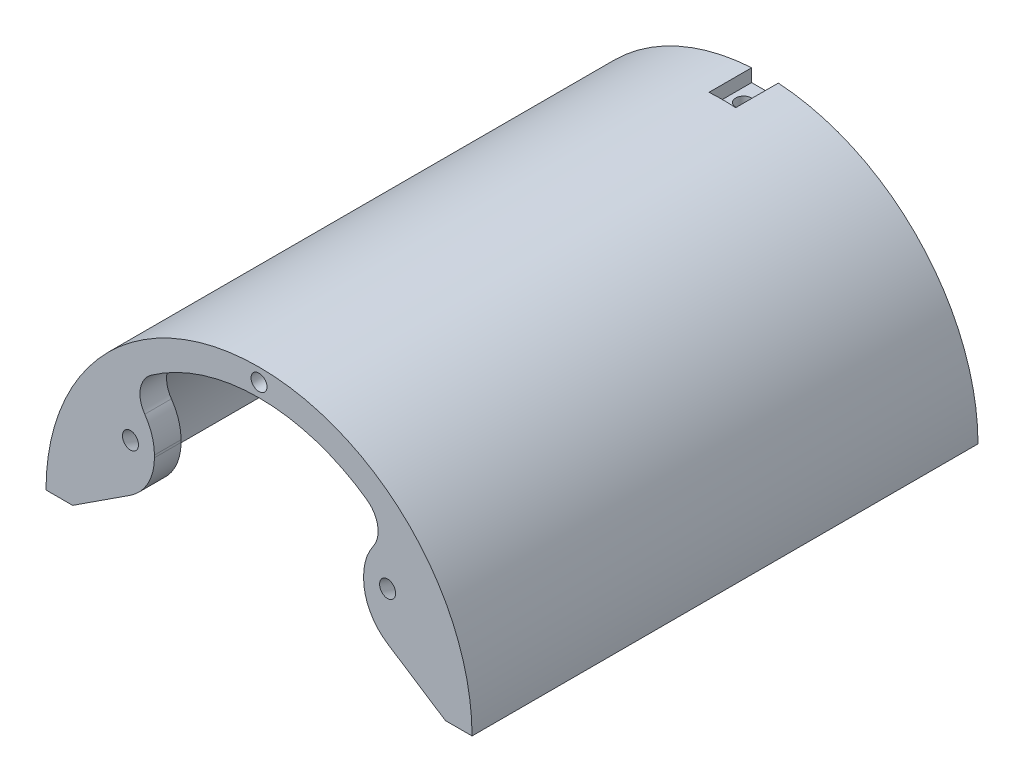
ISO-10303-21;
HEADER;
FILE_DESCRIPTION(('STEP AP214'),'2;1');
FILE_NAME('part.step','',(''),(''),'','','');
FILE_SCHEMA(('AUTOMOTIVE_DESIGN { 1 0 10303 214 1 1 1 1 }'));
ENDSEC;
DATA;
#1=APPLICATION_CONTEXT('core data for automotive mechanical design processes');
#2=APPLICATION_PROTOCOL_DEFINITION('international standard','automotive_design',2000,#1);
#3=PRODUCT_CONTEXT('',#1,'mechanical');
#4=PRODUCT('Part','Part','',(#3));
#5=PRODUCT_RELATED_PRODUCT_CATEGORY('part','',(#4));
#6=PRODUCT_DEFINITION_FORMATION('','',#4);
#7=PRODUCT_DEFINITION_CONTEXT('part definition',#1,'design');
#8=PRODUCT_DEFINITION('design','',#6,#7);
#9=PRODUCT_DEFINITION_SHAPE('','',#8);
#10=(LENGTH_UNIT() NAMED_UNIT(*) SI_UNIT(.MILLI.,.METRE.));
#11=(NAMED_UNIT(*) PLANE_ANGLE_UNIT() SI_UNIT($,.RADIAN.));
#12=(NAMED_UNIT(*) SI_UNIT($,.STERADIAN.) SOLID_ANGLE_UNIT());
#13=UNCERTAINTY_MEASURE_WITH_UNIT(LENGTH_MEASURE(1.E-05),#10,'distance_accuracy_value','');
#14=(GEOMETRIC_REPRESENTATION_CONTEXT(3) GLOBAL_UNCERTAINTY_ASSIGNED_CONTEXT((#13)) GLOBAL_UNIT_ASSIGNED_CONTEXT((#10,
#11,#12)) REPRESENTATION_CONTEXT('',''));
#15=CARTESIAN_POINT('',(0.,0.,0.));
#16=DIRECTION('',(0.,0.,1.));
#17=DIRECTION('',(1.,0.,0.));
#18=AXIS2_PLACEMENT_3D('',#15,#16,#17);
#19=CARTESIAN_POINT('',(0.,0.,95.));
#20=DIRECTION('',(0.,0.,-1.));
#21=DIRECTION('',(-1.,0.,0.));
#22=AXIS2_PLACEMENT_3D('',#19,#20,#21);
#23=CYLINDRICAL_SURFACE('',#22,35.);
#24=CARTESIAN_POINT('',(0.,0.,90.));
#25=DIRECTION('',(0.,0.,-1.));
#26=DIRECTION('',(-1.,0.,0.));
#27=AXIS2_PLACEMENT_3D('',#24,#25,#26);
#28=CIRCLE('',#27,35.);
#29=CARTESIAN_POINT('',(20.2514071764176,28.5461119484763,90.));
#30=VERTEX_POINT('',#29);
#31=CARTESIAN_POINT('',(35.,0.,90.));
#32=VERTEX_POINT('',#31);
#33=EDGE_CURVE('E270',#30,#32,#28,.T.);
#34=ORIENTED_EDGE('',*,*,#33,.F.);
#35=DIRECTION('',(0.,0.,-1.));
#36=VECTOR('',#35,1.);
#37=CARTESIAN_POINT('',(20.2514071764176,28.5461119484763,95.));
#38=LINE('',#37,#36);
#39=CARTESIAN_POINT('',(20.2514071764176,28.5461119484763,95.));
#40=VERTEX_POINT('',#39);
#41=EDGE_CURVE('E331',#30,#40,#38,.F.);
#42=ORIENTED_EDGE('',*,*,#41,.T.);
#43=CARTESIAN_POINT('',(0.,0.,95.));
#44=DIRECTION('',(0.,0.,1.));
#45=DIRECTION('',(1.,0.,0.));
#46=AXIS2_PLACEMENT_3D('',#43,#44,#45);
#47=CIRCLE('',#46,35.);
#48=CARTESIAN_POINT('',(-20.2514071764176,28.5461119484763,95.));
#49=VERTEX_POINT('',#48);
#50=EDGE_CURVE('E218',#40,#49,#47,.T.);
#51=ORIENTED_EDGE('',*,*,#50,.T.);
#52=DIRECTION('',(0.,0.,-1.));
#53=VECTOR('',#52,1.);
#54=CARTESIAN_POINT('',(-20.2514071764176,28.5461119484763,95.));
#55=LINE('',#54,#53);
#56=CARTESIAN_POINT('',(-20.2514071764176,28.5461119484763,90.));
#57=VERTEX_POINT('',#56);
#58=EDGE_CURVE('E327',#49,#57,#55,.T.);
#59=ORIENTED_EDGE('',*,*,#58,.T.);
#60=CARTESIAN_POINT('',(0.,0.,90.));
#61=DIRECTION('',(0.,0.,1.));
#62=DIRECTION('',(1.,0.,0.));
#63=AXIS2_PLACEMENT_3D('',#60,#61,#62);
#64=CIRCLE('',#63,35.);
#65=CARTESIAN_POINT('',(-35.,0.,90.));
#66=VERTEX_POINT('',#65);
#67=EDGE_CURVE('E370',#57,#66,#64,.T.);
#68=ORIENTED_EDGE('',*,*,#67,.T.);
#69=DIRECTION('',(0.,0.,-1.));
#70=VECTOR('',#69,1.);
#71=CARTESIAN_POINT('',(-35.,0.,95.));
#72=LINE('',#71,#70);
#73=CARTESIAN_POINT('',(-35.,0.,0.));
#74=VERTEX_POINT('',#73);
#75=EDGE_CURVE('E223',#66,#74,#72,.T.);
#76=ORIENTED_EDGE('',*,*,#75,.T.);
#77=CARTESIAN_POINT('',(0.,0.,0.));
#78=DIRECTION('',(0.,0.,1.));
#79=DIRECTION('',(1.,0.,0.));
#80=AXIS2_PLACEMENT_3D('',#77,#78,#79);
#81=CIRCLE('',#80,35.);
#82=CARTESIAN_POINT('',(35.,0.,0.));
#83=VERTEX_POINT('',#82);
#84=EDGE_CURVE('E214',#83,#74,#81,.T.);
#85=ORIENTED_EDGE('',*,*,#84,.F.);
#86=DIRECTION('',(0.,0.,-1.));
#87=VECTOR('',#86,1.);
#88=CARTESIAN_POINT('',(35.,0.,95.));
#89=LINE('',#88,#87);
#90=EDGE_CURVE('E224',#32,#83,#89,.T.);
#91=ORIENTED_EDGE('',*,*,#90,.F.);
#92=EDGE_LOOP('',(#34,#42,#51,#59,#68,#76,#85,#91));
#93=FACE_BOUND('',#92,.T.);
#94=CARTESIAN_POINT('',(0.,35.,5.5));
#95=CARTESIAN_POINT('',(-0.0842141773933812,34.9999995687038,5.49999627839367));
#96=CARTESIAN_POINT('',(-0.168488433020987,34.9996927984853,5.49288415881228));
#97=CARTESIAN_POINT('',(-0.334713142916146,34.9984985225936,5.46461278995566));
#98=CARTESIAN_POINT('',(-0.416660723394537,34.9976103287787,5.44343689511975));
#99=CARTESIAN_POINT('',(-0.575800034446508,34.9953537579411,5.38764446172472));
#100=CARTESIAN_POINT('',(-0.652994126083347,34.9939856216053,5.35303465922293));
#101=CARTESIAN_POINT('',(-0.800455673985712,34.9909233493655,5.27136692561602));
#102=CARTESIAN_POINT('',(-0.870724782932214,34.9892292915305,5.22431197452963));
#103=CARTESIAN_POINT('',(-1.00241774406214,34.9857043424946,5.11904823599837));
#104=CARTESIAN_POINT('',(-1.06383557240901,34.9838733593828,5.06083191476613));
#105=CARTESIAN_POINT('',(-1.17603137417381,34.980281720708,4.93491257329539));
#106=CARTESIAN_POINT('',(-1.22680891752576,34.9785210679899,4.8672091697863));
#107=CARTESIAN_POINT('',(-1.3162976374253,34.9752680292143,4.7242081391099));
#108=CARTESIAN_POINT('',(-1.35500437354876,34.9737757419643,4.64890773072248));
#109=CARTESIAN_POINT('',(-1.41922416901026,34.9712287687358,4.49286982802167));
#110=CARTESIAN_POINT('',(-1.4447373088634,34.970174080087,4.41213236689179));
#111=CARTESIAN_POINT('',(-1.48183048756292,34.9686220271413,4.24756524236876));
#112=CARTESIAN_POINT('',(-1.49341915651929,34.9681243176531,4.16373752749676));
#113=CARTESIAN_POINT('',(-1.50236104996785,34.9677413091198,3.99532520987646));
#114=CARTESIAN_POINT('',(-1.49971436377358,34.9678560062325,3.91074061188022));
#115=CARTESIAN_POINT('',(-1.48026789040832,34.9686845556764,3.74327417490877));
#116=CARTESIAN_POINT('',(-1.46347742450472,34.9693980134013,3.66039125131048));
#117=CARTESIAN_POINT('',(-1.41623444829705,34.9713430431507,3.49862151356354));
#118=CARTESIAN_POINT('',(-1.38578189170039,34.9725746169307,3.41973471295634));
#119=CARTESIAN_POINT('',(-1.31206849917113,34.9754175148246,3.26816648387337));
#120=CARTESIAN_POINT('',(-1.26880340379721,34.9770289651895,3.19548712938968));
#121=CARTESIAN_POINT('',(-1.17069618958064,34.9804498468775,3.05841959305896));
#122=CARTESIAN_POINT('',(-1.11585401192391,34.9822592792063,2.9940314533358));
#123=CARTESIAN_POINT('',(-0.996096749926197,34.9858739241882,2.87531982290765));
#124=CARTESIAN_POINT('',(-0.931173590451646,34.9876791322704,2.82100447798953));
#125=CARTESIAN_POINT('',(-0.79312571390509,34.9910804445647,2.72404299517928));
#126=CARTESIAN_POINT('',(-0.720000995136543,34.9926765487336,2.68139685970101));
#127=CARTESIAN_POINT('',(-0.567621069869864,34.995479802305,2.60898519348259));
#128=CARTESIAN_POINT('',(-0.488365733619494,34.9966869434726,2.57921993544939));
#129=CARTESIAN_POINT('',(-0.325976420367389,34.9985760880862,2.53342022271569));
#130=CARTESIAN_POINT('',(-0.242842464741656,34.999258094426,2.51738569235129));
#131=CARTESIAN_POINT('',(-0.075126523020424,35.0000197284916,2.49951261188446));
#132=CARTESIAN_POINT('',(0.00945426008265541,35.0000998343978,2.49766279269911));
#133=CARTESIAN_POINT('',(0.177725087075366,34.9996499072408,2.5081822527273));
#134=CARTESIAN_POINT('',(0.261415133116042,34.9991198756513,2.52055149759531));
#135=CARTESIAN_POINT('',(0.425497324935205,34.9975096951572,2.55914864179093));
#136=CARTESIAN_POINT('',(0.505890680469104,34.9964297500369,2.58537140748255));
#137=CARTESIAN_POINT('',(0.661134639785664,34.9938413731953,2.65092602134868));
#138=CARTESIAN_POINT('',(0.735985220227325,34.9923329396698,2.69025792472281));
#139=CARTESIAN_POINT('',(0.878070696644747,34.9890561827892,2.78094324974041));
#140=CARTESIAN_POINT('',(0.945300759285419,34.98728769611,2.83230423825126));
#141=CARTESIAN_POINT('',(1.0701882117262,34.9836906035575,2.94557870638664));
#142=CARTESIAN_POINT('',(1.12784555548201,34.9818619973951,3.00749223676546));
#143=CARTESIAN_POINT('',(1.2319887089577,34.9783494249298,3.14016269621984));
#144=CARTESIAN_POINT('',(1.27846723634721,34.9766655533692,3.21092534459797));
#145=CARTESIAN_POINT('',(1.35888363763632,34.9736338053594,3.35925635663163));
#146=CARTESIAN_POINT('',(1.3928215552549,34.9722859277388,3.43682469656005));
#147=CARTESIAN_POINT('',(1.44718063191892,34.9700788276315,3.59653805104394));
#148=CARTESIAN_POINT('',(1.4676064617553,34.9692194363017,3.67868147345112));
#149=CARTESIAN_POINT('',(1.49437683697421,34.9680857373277,3.84523561565203));
#150=CARTESIAN_POINT('',(1.50072143423487,34.9678114275279,3.92964632709146));
#151=CARTESIAN_POINT('',(1.49914871069467,34.9678788823128,4.09826635950605));
#152=CARTESIAN_POINT('',(1.49124285296202,34.9682201517256,4.18247578783743));
#153=CARTESIAN_POINT('',(1.46141729365384,34.9694792533025,4.3483707611638));
#154=CARTESIAN_POINT('',(1.4394975648702,34.9703970865859,4.43005630125831));
#155=CARTESIAN_POINT('',(1.38226864245956,34.9727057575905,4.58858763612856));
#156=CARTESIAN_POINT('',(1.34695928623372,34.9740966010557,4.66543337211823));
#157=CARTESIAN_POINT('',(1.26395579379531,34.9771944696407,4.8121059488097));
#158=CARTESIAN_POINT('',(1.21626206564919,34.9789014843421,4.88193302067212));
#159=CARTESIAN_POINT('',(1.10980407972214,34.9824408146562,5.01264247038006));
#160=CARTESIAN_POINT('',(1.05103213534307,34.984273216703,5.07351858510265));
#161=CARTESIAN_POINT('',(0.924085378422847,34.9878563121508,5.18455820869491));
#162=CARTESIAN_POINT('',(0.855908250089803,34.9896069852856,5.23471907142506));
#163=CARTESIAN_POINT('',(0.71204411229204,34.992830278554,5.32292152087255));
#164=CARTESIAN_POINT('',(0.63635092610815,34.9943026670589,5.36095302973176));
#165=CARTESIAN_POINT('',(0.47970475566945,34.9967997658715,5.42372284790231));
#166=CARTESIAN_POINT('',(0.398758137226582,34.9978250067872,5.44847692096167));
#167=CARTESIAN_POINT('',(0.264420890708546,34.9990399346826,5.47746831165779));
#168=CARTESIAN_POINT('',(0.211901171146152,34.9993983853024,5.48590697225835));
#169=CARTESIAN_POINT('',(0.106262275599526,34.9998785539722,5.49717398895523));
#170=CARTESIAN_POINT('',(0.0531430999846706,35.0000002721682,5.50000234850834));
#171=CARTESIAN_POINT('',(0.,35.,5.5));
#172=B_SPLINE_CURVE_WITH_KNOTS('',3,(#94,#95,#96,#97,#98,#99,#100,#101,#102,#103,#104,#105,#106,
#107,#108,#109,#110,#111,#112,#113,#114,#115,#116,#117,#118,#119,#120,#121,#122,#123,#124,#125,
#126,#127,#128,#129,#130,#131,#132,#133,#134,#135,#136,#137,#138,#139,#140,#141,#142,#143,#144,
#145,#146,#147,#148,#149,#150,#151,#152,#153,#154,#155,#156,#157,#158,#159,#160,#161,#162,#163,
#164,#165,#166,#167,#168,#169,#170,#171),.UNSPECIFIED.,.T.,.F.,(4,2,2,2,2,2,2,2,2,2,2,2,2,2,2,2,
2,2,2,2,2,2,2,2,2,2,2,2,2,2,2,2,2,2,2,2,2,2,4),(0.,0.252448545444622,0.505196416931058,
0.757817718441212,1.01037858389476,1.26311052885797,1.51585268693641,1.76868771056216,
2.02152119122104,2.274197889757,2.52687300298501,2.77938172424761,3.03189130111635,
3.28448491749188,3.5370798171289,3.78987810582186,4.04267644680776,4.29548013964122,
4.54828243937758,4.8008838788007,5.05348470807733,5.30599199780728,5.55850035080205,
5.81116797223335,6.0638368089481,6.3166698011679,6.56950191195506,6.82224657926928,
7.07499031541883,7.32753083518844,7.5800718452701,7.83261592221738,8.08515167886445,
8.33786330626551,8.59063726903107,8.84362070902732,9.09630312369772,9.25561010707058,
9.41491699228634),.UNSPECIFIED.);
#173=CARTESIAN_POINT('',(0.,35.,5.5));
#174=VERTEX_POINT('',#173);
#175=EDGE_CURVE('E184',#174,#174,#172,.T.);
#176=ORIENTED_EDGE('',*,*,#175,.F.);
#177=EDGE_LOOP('',(#176));
#178=FACE_BOUND('',#177,.T.);
#179=ADVANCED_FACE('F44',(#93,#178),#23,.F.);
#180=CARTESIAN_POINT('',(0.,0.,95.));
#181=DIRECTION('',(0.,0.,-1.));
#182=DIRECTION('',(-1.,0.,0.));
#183=AXIS2_PLACEMENT_3D('',#180,#181,#182);
#184=CYLINDRICAL_SURFACE('',#183,40.);
#185=DIRECTION('',(0.,0.,-1.));
#186=VECTOR('',#185,1.);
#187=CARTESIAN_POINT('',(-40.,0.,95.));
#188=LINE('',#187,#186);
#189=CARTESIAN_POINT('',(-40.,0.,95.));
#190=VERTEX_POINT('',#189);
#191=CARTESIAN_POINT('',(-40.,0.,0.));
#192=VERTEX_POINT('',#191);
#193=EDGE_CURVE('E254',#190,#192,#188,.T.);
#194=ORIENTED_EDGE('',*,*,#193,.F.);
#195=CARTESIAN_POINT('',(0.,0.,95.));
#196=DIRECTION('',(0.,0.,1.));
#197=DIRECTION('',(1.,0.,0.));
#198=AXIS2_PLACEMENT_3D('',#195,#196,#197);
#199=CIRCLE('',#198,40.);
#200=CARTESIAN_POINT('',(40.,0.,95.));
#201=VERTEX_POINT('',#200);
#202=EDGE_CURVE('E233',#201,#190,#199,.T.);
#203=ORIENTED_EDGE('',*,*,#202,.F.);
#204=DIRECTION('',(0.,0.,-1.));
#205=VECTOR('',#204,1.);
#206=CARTESIAN_POINT('',(40.,0.,95.));
#207=LINE('',#206,#205);
#208=CARTESIAN_POINT('',(40.,0.,0.));
#209=VERTEX_POINT('',#208);
#210=EDGE_CURVE('E242',#201,#209,#207,.T.);
#211=ORIENTED_EDGE('',*,*,#210,.T.);
#212=CARTESIAN_POINT('',(0.,0.,0.));
#213=DIRECTION('',(0.,0.,1.));
#214=DIRECTION('',(1.,0.,0.));
#215=AXIS2_PLACEMENT_3D('',#212,#213,#214);
#216=CIRCLE('',#215,40.);
#217=CARTESIAN_POINT('',(2.5,39.9217985566783,0.));
#218=VERTEX_POINT('',#217);
#219=EDGE_CURVE('E243',#209,#218,#216,.T.);
#220=ORIENTED_EDGE('',*,*,#219,.T.);
#221=DIRECTION('',(0.,0.,-1.));
#222=VECTOR('',#221,1.);
#223=CARTESIAN_POINT('',(2.50000000000003,39.9217985566783,95.));
#224=LINE('',#223,#222);
#225=CARTESIAN_POINT('',(2.5,39.9217985566783,8.00000000000001));
#226=VERTEX_POINT('',#225);
#227=EDGE_CURVE('E207',#218,#226,#224,.F.);
#228=ORIENTED_EDGE('',*,*,#227,.T.);
#229=CARTESIAN_POINT('',(0.,0.,8.00000000000001));
#230=DIRECTION('',(0.,0.,1.));
#231=DIRECTION('',(1.,0.,0.));
#232=AXIS2_PLACEMENT_3D('',#229,#230,#231);
#233=CIRCLE('',#232,40.);
#234=CARTESIAN_POINT('',(-2.5,39.9217985566783,8.00000000000001));
#235=VERTEX_POINT('',#234);
#236=EDGE_CURVE('E267',#226,#235,#233,.T.);
#237=ORIENTED_EDGE('',*,*,#236,.T.);
#238=DIRECTION('',(0.,0.,-1.));
#239=VECTOR('',#238,1.);
#240=CARTESIAN_POINT('',(-2.49999999999997,39.9217985566783,95.));
#241=LINE('',#240,#239);
#242=CARTESIAN_POINT('',(-2.5,39.9217985566783,0.));
#243=VERTEX_POINT('',#242);
#244=EDGE_CURVE('E190',#235,#243,#241,.T.);
#245=ORIENTED_EDGE('',*,*,#244,.T.);
#246=EDGE_CURVE('E232',#243,#192,#216,.T.);
#247=ORIENTED_EDGE('',*,*,#246,.T.);
#248=EDGE_LOOP('',(#194,#203,#211,#220,#228,#237,#245,#247));
#249=FACE_BOUND('',#248,.T.);
#250=ADVANCED_FACE('F420',(#249),#184,.T.);
#251=CARTESIAN_POINT('',(19.6410161513775,20.,100.));
#252=DIRECTION('',(1.,0.,0.));
#253=DIRECTION('',(0.,1.,0.));
#254=AXIS2_PLACEMENT_3D('',#251,#252,#253);
#255=PLANE('',#254);
#256=DIRECTION('',(0.,-1.,0.));
#257=VECTOR('',#256,1.);
#258=CARTESIAN_POINT('',(19.6410161513775,20.,90.));
#259=LINE('',#258,#257);
#260=CARTESIAN_POINT('',(19.6410161513775,15.857864376269,90.));
#261=VERTEX_POINT('',#260);
#262=CARTESIAN_POINT('',(19.6410161513775,15.4219282162028,90.));
#263=VERTEX_POINT('',#262);
#264=EDGE_CURVE('E375',#261,#263,#259,.T.);
#265=ORIENTED_EDGE('',*,*,#264,.T.);
#266=DIRECTION('',(0.,0.,-1.));
#267=VECTOR('',#266,1.);
#268=CARTESIAN_POINT('',(19.6410161513775,15.4219282162028,95.));
#269=LINE('',#268,#267);
#270=CARTESIAN_POINT('',(19.6410161513775,15.4219282162028,95.));
#271=VERTEX_POINT('',#270);
#272=EDGE_CURVE('E295',#263,#271,#269,.F.);
#273=ORIENTED_EDGE('',*,*,#272,.T.);
#274=DIRECTION('',(0.,-1.,0.));
#275=VECTOR('',#274,1.);
#276=CARTESIAN_POINT('',(19.6410161513775,20.,95.));
#277=LINE('',#276,#275);
#278=CARTESIAN_POINT('',(19.6410161513775,15.857864376269,95.));
#279=VERTEX_POINT('',#278);
#280=EDGE_CURVE('E466',#279,#271,#277,.T.);
#281=ORIENTED_EDGE('',*,*,#280,.F.);
#282=DIRECTION('',(0.,0.,-1.));
#283=VECTOR('',#282,1.);
#284=CARTESIAN_POINT('',(19.6410161513775,15.857864376269,90.));
#285=LINE('',#284,#283);
#286=EDGE_CURVE('E291',#279,#261,#285,.T.);
#287=ORIENTED_EDGE('',*,*,#286,.T.);
#288=EDGE_LOOP('',(#265,#273,#281,#287));
#289=FACE_BOUND('',#288,.T.);
#290=ADVANCED_FACE('F405',(#289),#255,.F.);
#291=CARTESIAN_POINT('',(-19.6410161513775,20.,100.));
#292=DIRECTION('',(-1.,0.,0.));
#293=DIRECTION('',(0.,-1.,0.));
#294=AXIS2_PLACEMENT_3D('',#291,#292,#293);
#295=PLANE('',#294);
#296=DIRECTION('',(0.,1.,0.));
#297=VECTOR('',#296,1.);
#298=CARTESIAN_POINT('',(-19.6410161513775,20.,90.));
#299=LINE('',#298,#297);
#300=CARTESIAN_POINT('',(-19.6410161513775,15.4219282162028,90.));
#301=VERTEX_POINT('',#300);
#302=CARTESIAN_POINT('',(-19.6410161513775,15.857864376269,90.));
#303=VERTEX_POINT('',#302);
#304=EDGE_CURVE('E364',#301,#303,#299,.T.);
#305=ORIENTED_EDGE('',*,*,#304,.T.);
#306=DIRECTION('',(0.,0.,-1.));
#307=VECTOR('',#306,1.);
#308=CARTESIAN_POINT('',(-19.6410161513775,15.857864376269,95.));
#309=LINE('',#308,#307);
#310=CARTESIAN_POINT('',(-19.6410161513775,15.857864376269,95.));
#311=VERTEX_POINT('',#310);
#312=EDGE_CURVE('E321',#303,#311,#309,.F.);
#313=ORIENTED_EDGE('',*,*,#312,.T.);
#314=DIRECTION('',(0.,1.,0.));
#315=VECTOR('',#314,1.);
#316=CARTESIAN_POINT('',(-19.6410161513775,20.,95.));
#317=LINE('',#316,#315);
#318=CARTESIAN_POINT('',(-19.6410161513775,15.4219282162028,95.));
#319=VERTEX_POINT('',#318);
#320=EDGE_CURVE('E469',#319,#311,#317,.T.);
#321=ORIENTED_EDGE('',*,*,#320,.F.);
#322=DIRECTION('',(0.,0.,-1.));
#323=VECTOR('',#322,1.);
#324=CARTESIAN_POINT('',(-19.6410161513775,15.4219282162028,90.));
#325=LINE('',#324,#323);
#326=EDGE_CURVE('E317',#319,#301,#325,.T.);
#327=ORIENTED_EDGE('',*,*,#326,.T.);
#328=EDGE_LOOP('',(#305,#313,#321,#327));
#329=FACE_BOUND('',#328,.T.);
#330=ADVANCED_FACE('F366',(#329),#295,.F.);
#331=CARTESIAN_POINT('',(-24.1410161513775,-16.3940471609343,5.96694518573637));
#332=DIRECTION('',(0.,0.342020143325665,0.93969262078591));
#333=DIRECTION('',(0.,-0.93969262078591,0.342020143325665));
#334=AXIS2_PLACEMENT_3D('',#331,#332,#333);
#335=CYLINDRICAL_SURFACE('',#334,1.5);
#336=CARTESIAN_POINT('',(-24.1410161513775,14.1914834859175,90.));
#337=DIRECTION('',(0.,0.,1.));
#338=DIRECTION('',(0.,1.,0.));
#339=AXIS2_PLACEMENT_3D('',#336,#337,#338);
#340=ELLIPSE('',#339,1.59626665871387,1.5);
#341=CARTESIAN_POINT('',(-24.1410161513775,15.7877501446313,90.));
#342=VERTEX_POINT('',#341);
#343=EDGE_CURVE('E378',#342,#342,#340,.T.);
#344=ORIENTED_EDGE('',*,*,#343,.F.);
#345=EDGE_LOOP('',(#344));
#346=FACE_BOUND('',#345,.T.);
#347=CARTESIAN_POINT('',(-24.1410161513775,16.0113346572485,95.));
#348=DIRECTION('',(0.,0.,1.));
#349=DIRECTION('',(0.,1.,0.));
#350=AXIS2_PLACEMENT_3D('',#347,#348,#349);
#351=ELLIPSE('',#350,1.59626665871387,1.5);
#352=CARTESIAN_POINT('',(-24.1410161513775,17.6076013159623,95.));
#353=VERTEX_POINT('',#352);
#354=EDGE_CURVE('E279',#353,#353,#351,.F.);
#355=ORIENTED_EDGE('',*,*,#354,.F.);
#356=EDGE_LOOP('',(#355));
#357=FACE_BOUND('',#356,.T.);
#358=ADVANCED_FACE('F516',(#346,#357),#335,.F.);
#359=CARTESIAN_POINT('',(24.1410161513775,-16.3940471609343,5.96694518573637));
#360=DIRECTION('',(0.,0.342020143325665,0.93969262078591));
#361=DIRECTION('',(0.,-0.93969262078591,0.342020143325665));
#362=AXIS2_PLACEMENT_3D('',#359,#360,#361);
#363=CYLINDRICAL_SURFACE('',#362,1.5);
#364=CARTESIAN_POINT('',(24.1410161513775,14.1914834859175,90.));
#365=DIRECTION('',(0.,0.,-1.));
#366=DIRECTION('',(0.,1.,0.));
#367=AXIS2_PLACEMENT_3D('',#364,#365,#366);
#368=ELLIPSE('',#367,1.59626665871387,1.5);
#369=CARTESIAN_POINT('',(24.1410161513775,15.7877501446313,90.));
#370=VERTEX_POINT('',#369);
#371=EDGE_CURVE('E371',#370,#370,#368,.T.);
#372=ORIENTED_EDGE('',*,*,#371,.T.);
#373=EDGE_LOOP('',(#372));
#374=FACE_BOUND('',#373,.T.);
#375=CARTESIAN_POINT('',(24.1410161513775,16.0113346572485,95.));
#376=DIRECTION('',(0.,0.,1.));
#377=DIRECTION('',(0.,1.,0.));
#378=AXIS2_PLACEMENT_3D('',#375,#376,#377);
#379=ELLIPSE('',#378,1.59626665871387,1.5);
#380=CARTESIAN_POINT('',(24.1410161513775,17.6076013159623,95.));
#381=VERTEX_POINT('',#380);
#382=EDGE_CURVE('E275',#381,#381,#379,.F.);
#383=ORIENTED_EDGE('',*,*,#382,.F.);
#384=EDGE_LOOP('',(#383));
#385=FACE_BOUND('',#384,.T.);
#386=ADVANCED_FACE('F510',(#374,#385),#363,.F.);
#387=CARTESIAN_POINT('',(0.,0.,95.));
#388=DIRECTION('',(0.,0.,1.));
#389=DIRECTION('',(1.,0.,0.));
#390=AXIS2_PLACEMENT_3D('',#387,#388,#389);
#391=PLANE('',#390);
#392=CARTESIAN_POINT('',(0.,37.5,95.));
#393=DIRECTION('',(0.,0.,1.));
#394=DIRECTION('',(1.,0.,0.));
#395=AXIS2_PLACEMENT_3D('',#392,#393,#394);
#396=CIRCLE('',#395,1.5);
#397=CARTESIAN_POINT('',(1.5,37.5,95.));
#398=VERTEX_POINT('',#397);
#399=EDGE_CURVE('E493',#398,#398,#396,.T.);
#400=ORIENTED_EDGE('',*,*,#399,.F.);
#401=EDGE_LOOP('',(#400));
#402=FACE_BOUND('',#401,.T.);
#403=ORIENTED_EDGE('',*,*,#280,.T.);
#404=CARTESIAN_POINT('',(29.6410161513775,15.4219282162028,95.));
#405=DIRECTION('',(0.,0.,1.));
#406=DIRECTION('',(1.,0.,0.));
#407=AXIS2_PLACEMENT_3D('',#404,#405,#406);
#408=CIRCLE('',#407,10.);
#409=CARTESIAN_POINT('',(24.1847437737592,7.04164828405028,95.));
#410=VERTEX_POINT('',#409);
#411=EDGE_CURVE('E308',#271,#410,#408,.T.);
#412=ORIENTED_EDGE('',*,*,#411,.T.);
#413=DIRECTION('',(0.838027993215255,-0.545627237761837,0.));
#414=VECTOR('',#413,1.);
#415=CARTESIAN_POINT('',(19.6410161513775,10.,95.));
#416=LINE('',#415,#414);
#417=CARTESIAN_POINT('',(35.,0.,95.));
#418=VERTEX_POINT('',#417);
#419=EDGE_CURVE('E479',#410,#418,#416,.T.);
#420=ORIENTED_EDGE('',*,*,#419,.T.);
#421=DIRECTION('',(1.,0.,0.));
#422=VECTOR('',#421,1.);
#423=CARTESIAN_POINT('',(-40.,0.,95.));
#424=LINE('',#423,#422);
#425=EDGE_CURVE('E236',#418,#201,#424,.T.);
#426=ORIENTED_EDGE('',*,*,#425,.T.);
#427=ORIENTED_EDGE('',*,*,#202,.T.);
#428=CARTESIAN_POINT('',(-35.,0.,95.));
#429=VERTEX_POINT('',#428);
#430=EDGE_CURVE('E238',#190,#429,#424,.T.);
#431=ORIENTED_EDGE('',*,*,#430,.T.);
#432=DIRECTION('',(0.838027993215255,0.545627237761837,0.));
#433=VECTOR('',#432,1.);
#434=CARTESIAN_POINT('',(-19.6410161513775,10.,95.));
#435=LINE('',#434,#433);
#436=CARTESIAN_POINT('',(-24.1847437737592,7.04164828405028,95.));
#437=VERTEX_POINT('',#436);
#438=EDGE_CURVE('E482',#429,#437,#435,.T.);
#439=ORIENTED_EDGE('',*,*,#438,.T.);
#440=CARTESIAN_POINT('',(-29.6410161513775,15.4219282162028,95.));
#441=DIRECTION('',(0.,0.,1.));
#442=DIRECTION('',(1.,0.,0.));
#443=AXIS2_PLACEMENT_3D('',#440,#441,#442);
#444=CIRCLE('',#443,10.);
#445=EDGE_CURVE('E298',#437,#319,#444,.T.);
#446=ORIENTED_EDGE('',*,*,#445,.T.);
#447=ORIENTED_EDGE('',*,*,#320,.T.);
#448=CARTESIAN_POINT('',(-29.6410161513775,15.857864376269,95.));
#449=DIRECTION('',(0.,0.,1.));
#450=DIRECTION('',(1.,0.,0.));
#451=AXIS2_PLACEMENT_3D('',#448,#449,#450);
#452=CIRCLE('',#451,10.);
#453=CARTESIAN_POINT('',(-21.4525713893645,21.5980187626476,95.));
#454=VERTEX_POINT('',#453);
#455=EDGE_CURVE('E301',#311,#454,#452,.T.);
#456=ORIENTED_EDGE('',*,*,#455,.T.);
#457=CARTESIAN_POINT('',(-17.358349008358,24.4680959558368,95.));
#458=DIRECTION('',(0.,0.,1.));
#459=DIRECTION('',(1.,0.,0.));
#460=AXIS2_PLACEMENT_3D('',#457,#458,#459);
#461=CIRCLE('',#460,5.);
#462=EDGE_CURVE('E53',#454,#49,#461,.F.);
#463=ORIENTED_EDGE('',*,*,#462,.T.);
#464=ORIENTED_EDGE('',*,*,#50,.F.);
#465=CARTESIAN_POINT('',(17.358349008358,24.4680959558368,95.));
#466=DIRECTION('',(0.,0.,1.));
#467=DIRECTION('',(1.,0.,0.));
#468=AXIS2_PLACEMENT_3D('',#465,#466,#467);
#469=CIRCLE('',#468,5.);
#470=CARTESIAN_POINT('',(21.4525713893645,21.5980187626476,95.));
#471=VERTEX_POINT('',#470);
#472=EDGE_CURVE('E341',#40,#471,#469,.F.);
#473=ORIENTED_EDGE('',*,*,#472,.T.);
#474=CARTESIAN_POINT('',(29.6410161513775,15.857864376269,95.));
#475=DIRECTION('',(0.,0.,1.));
#476=DIRECTION('',(1.,0.,0.));
#477=AXIS2_PLACEMENT_3D('',#474,#475,#476);
#478=CIRCLE('',#477,10.);
#479=EDGE_CURVE('E305',#471,#279,#478,.T.);
#480=ORIENTED_EDGE('',*,*,#479,.T.);
#481=EDGE_LOOP('',(#403,#412,#420,#426,#427,#431,#439,#446,#447,#456,#463,#464,#473,#480));
#482=FACE_BOUND('',#481,.T.);
#483=ORIENTED_EDGE('',*,*,#382,.T.);
#484=EDGE_LOOP('',(#483));
#485=FACE_BOUND('',#484,.T.);
#486=ORIENTED_EDGE('',*,*,#354,.T.);
#487=EDGE_LOOP('',(#486));
#488=FACE_BOUND('',#487,.T.);
#489=ADVANCED_FACE('F351',(#402,#482,#485,#488),#391,.T.);
#490=CARTESIAN_POINT('',(-40.,0.,95.));
#491=DIRECTION('',(0.,1.,0.));
#492=DIRECTION('',(0.,0.,1.));
#493=AXIS2_PLACEMENT_3D('',#490,#491,#492);
#494=PLANE('',#493);
#495=EDGE_CURVE('E228',#429,#66,#72,.T.);
#496=ORIENTED_EDGE('',*,*,#495,.F.);
#497=ORIENTED_EDGE('',*,*,#430,.F.);
#498=ORIENTED_EDGE('',*,*,#193,.T.);
#499=DIRECTION('',(1.,0.,0.));
#500=VECTOR('',#499,1.);
#501=CARTESIAN_POINT('',(-40.,0.,0.));
#502=LINE('',#501,#500);
#503=EDGE_CURVE('E237',#192,#74,#502,.T.);
#504=ORIENTED_EDGE('',*,*,#503,.T.);
#505=ORIENTED_EDGE('',*,*,#75,.F.);
#506=EDGE_LOOP('',(#496,#497,#498,#504,#505));
#507=FACE_BOUND('',#506,.T.);
#508=ADVANCED_FACE('F509',(#507),#494,.F.);
#509=ORIENTED_EDGE('',*,*,#425,.F.);
#510=EDGE_CURVE('E219',#418,#32,#89,.T.);
#511=ORIENTED_EDGE('',*,*,#510,.T.);
#512=ORIENTED_EDGE('',*,*,#90,.T.);
#513=EDGE_CURVE('E247',#83,#209,#502,.T.);
#514=ORIENTED_EDGE('',*,*,#513,.T.);
#515=ORIENTED_EDGE('',*,*,#210,.F.);
#516=EDGE_LOOP('',(#509,#511,#512,#514,#515));
#517=FACE_BOUND('',#516,.T.);
#518=ADVANCED_FACE('F433',(#517),#494,.F.);
#519=CARTESIAN_POINT('',(0.,0.,0.));
#520=DIRECTION('',(0.,0.,1.));
#521=DIRECTION('',(1.,0.,0.));
#522=AXIS2_PLACEMENT_3D('',#519,#520,#521);
#523=PLANE('',#522);
#524=ORIENTED_EDGE('',*,*,#246,.F.);
#525=DIRECTION('',(0.,-1.,0.));
#526=VECTOR('',#525,1.);
#527=CARTESIAN_POINT('',(-2.5,0.,0.));
#528=LINE('',#527,#526);
#529=CARTESIAN_POINT('',(-2.5,37.5,0.));
#530=VERTEX_POINT('',#529);
#531=EDGE_CURVE('E264',#243,#530,#528,.T.);
#532=ORIENTED_EDGE('',*,*,#531,.T.);
#533=DIRECTION('',(1.,0.,0.));
#534=VECTOR('',#533,1.);
#535=CARTESIAN_POINT('',(0.,37.5,0.));
#536=LINE('',#535,#534);
#537=CARTESIAN_POINT('',(2.5,37.5,0.));
#538=VERTEX_POINT('',#537);
#539=EDGE_CURVE('E180',#530,#538,#536,.T.);
#540=ORIENTED_EDGE('',*,*,#539,.T.);
#541=DIRECTION('',(0.,1.,0.));
#542=VECTOR('',#541,1.);
#543=CARTESIAN_POINT('',(2.5,0.,0.));
#544=LINE('',#543,#542);
#545=EDGE_CURVE('E260',#538,#218,#544,.T.);
#546=ORIENTED_EDGE('',*,*,#545,.T.);
#547=ORIENTED_EDGE('',*,*,#219,.F.);
#548=ORIENTED_EDGE('',*,*,#513,.F.);
#549=ORIENTED_EDGE('',*,*,#84,.T.);
#550=ORIENTED_EDGE('',*,*,#503,.F.);
#551=EDGE_LOOP('',(#524,#532,#540,#546,#547,#548,#549,#550));
#552=FACE_BOUND('',#551,.T.);
#553=ADVANCED_FACE('F415',(#552),#523,.F.);
#554=CARTESIAN_POINT('',(2.5,37.5,8.));
#555=DIRECTION('',(0.,0.,1.));
#556=DIRECTION('',(1.,0.,0.));
#557=AXIS2_PLACEMENT_3D('',#554,#555,#556);
#558=PLANE('',#557);
#559=DIRECTION('',(0.,1.,0.));
#560=VECTOR('',#559,1.);
#561=CARTESIAN_POINT('',(2.5,37.5,8.));
#562=LINE('',#561,#560);
#563=CARTESIAN_POINT('',(2.5,37.5,8.));
#564=VERTEX_POINT('',#563);
#565=EDGE_CURVE('E194',#564,#226,#562,.T.);
#566=ORIENTED_EDGE('',*,*,#565,.F.);
#567=DIRECTION('',(1.,0.,0.));
#568=VECTOR('',#567,1.);
#569=CARTESIAN_POINT('',(2.5,37.5,8.));
#570=LINE('',#569,#568);
#571=CARTESIAN_POINT('',(-2.5,37.5,8.));
#572=VERTEX_POINT('',#571);
#573=EDGE_CURVE('E178',#572,#564,#570,.T.);
#574=ORIENTED_EDGE('',*,*,#573,.F.);
#575=DIRECTION('',(0.,1.,0.));
#576=VECTOR('',#575,1.);
#577=CARTESIAN_POINT('',(-2.5,37.5,8.));
#578=LINE('',#577,#576);
#579=EDGE_CURVE('E187',#572,#235,#578,.T.);
#580=ORIENTED_EDGE('',*,*,#579,.T.);
#581=ORIENTED_EDGE('',*,*,#236,.F.);
#582=EDGE_LOOP('',(#566,#574,#580,#581));
#583=FACE_BOUND('',#582,.T.);
#584=ADVANCED_FACE('F197',(#583),#558,.F.);
#585=CARTESIAN_POINT('',(-2.5,37.5,-8.));
#586=DIRECTION('',(-1.,0.,0.));
#587=DIRECTION('',(0.,0.,1.));
#588=AXIS2_PLACEMENT_3D('',#585,#586,#587);
#589=PLANE('',#588);
#590=ORIENTED_EDGE('',*,*,#579,.F.);
#591=DIRECTION('',(0.,0.,1.));
#592=VECTOR('',#591,1.);
#593=CARTESIAN_POINT('',(-2.5,37.5,-8.));
#594=LINE('',#593,#592);
#595=EDGE_CURVE('E174',#530,#572,#594,.T.);
#596=ORIENTED_EDGE('',*,*,#595,.F.);
#597=ORIENTED_EDGE('',*,*,#531,.F.);
#598=ORIENTED_EDGE('',*,*,#244,.F.);
#599=EDGE_LOOP('',(#590,#596,#597,#598));
#600=FACE_BOUND('',#599,.T.);
#601=ADVANCED_FACE('F188',(#600),#589,.F.);
#602=CARTESIAN_POINT('',(2.5,37.5,-8.));
#603=DIRECTION('',(1.,0.,0.));
#604=DIRECTION('',(0.,0.,-1.));
#605=AXIS2_PLACEMENT_3D('',#602,#603,#604);
#606=PLANE('',#605);
#607=ORIENTED_EDGE('',*,*,#545,.F.);
#608=DIRECTION('',(0.,0.,-1.));
#609=VECTOR('',#608,1.);
#610=CARTESIAN_POINT('',(2.5,37.5,-8.));
#611=LINE('',#610,#609);
#612=EDGE_CURVE('E195',#564,#538,#611,.T.);
#613=ORIENTED_EDGE('',*,*,#612,.F.);
#614=ORIENTED_EDGE('',*,*,#565,.T.);
#615=ORIENTED_EDGE('',*,*,#227,.F.);
#616=EDGE_LOOP('',(#607,#613,#614,#615));
#617=FACE_BOUND('',#616,.T.);
#618=ADVANCED_FACE('F409',(#617),#606,.F.);
#619=CARTESIAN_POINT('',(0.,37.5,0.));
#620=DIRECTION('',(0.,-1.,0.));
#621=DIRECTION('',(0.,0.,-1.));
#622=AXIS2_PLACEMENT_3D('',#619,#620,#621);
#623=PLANE('',#622);
#624=CARTESIAN_POINT('',(0.,37.5,4.));
#625=DIRECTION('',(0.,1.,0.));
#626=DIRECTION('',(0.,0.,1.));
#627=AXIS2_PLACEMENT_3D('',#624,#625,#626);
#628=CIRCLE('',#627,1.5);
#629=CARTESIAN_POINT('',(0.,37.5,5.5));
#630=VERTEX_POINT('',#629);
#631=EDGE_CURVE('E385',#630,#630,#628,.T.);
#632=ORIENTED_EDGE('',*,*,#631,.F.);
#633=EDGE_LOOP('',(#632));
#634=FACE_BOUND('',#633,.T.);
#635=ORIENTED_EDGE('',*,*,#595,.T.);
#636=ORIENTED_EDGE('',*,*,#573,.T.);
#637=ORIENTED_EDGE('',*,*,#612,.T.);
#638=ORIENTED_EDGE('',*,*,#539,.F.);
#639=EDGE_LOOP('',(#635,#636,#637,#638));
#640=FACE_BOUND('',#639,.T.);
#641=ADVANCED_FACE('F176',(#634,#640),#623,.F.);
#642=CARTESIAN_POINT('',(0.,32.5,4.));
#643=DIRECTION('',(0.,1.,0.));
#644=DIRECTION('',(0.,0.,1.));
#645=AXIS2_PLACEMENT_3D('',#642,#643,#644);
#646=CYLINDRICAL_SURFACE('',#645,1.5);
#647=ORIENTED_EDGE('',*,*,#175,.T.);
#648=EDGE_LOOP('',(#647));
#649=FACE_BOUND('',#648,.T.);
#650=ORIENTED_EDGE('',*,*,#631,.T.);
#651=EDGE_LOOP('',(#650));
#652=FACE_BOUND('',#651,.T.);
#653=ADVANCED_FACE('F398',(#649,#652),#646,.F.);
#654=CARTESIAN_POINT('',(0.,0.,90.));
#655=DIRECTION('',(0.,0.,-1.));
#656=DIRECTION('',(-1.,0.,0.));
#657=AXIS2_PLACEMENT_3D('',#654,#655,#656);
#658=PLANE('',#657);
#659=ORIENTED_EDGE('',*,*,#371,.F.);
#660=EDGE_LOOP('',(#659));
#661=FACE_BOUND('',#660,.T.);
#662=DIRECTION('',(0.838027993215255,-0.545627237761837,0.));
#663=VECTOR('',#662,1.);
#664=CARTESIAN_POINT('',(19.6410161513775,10.,90.));
#665=LINE('',#664,#663);
#666=CARTESIAN_POINT('',(24.1847437737592,7.04164828405028,90.));
#667=VERTEX_POINT('',#666);
#668=EDGE_CURVE('E280',#667,#32,#665,.T.);
#669=ORIENTED_EDGE('',*,*,#668,.F.);
#670=CARTESIAN_POINT('',(29.6410161513775,15.4219282162028,90.));
#671=DIRECTION('',(0.,0.,-1.));
#672=DIRECTION('',(-1.,0.,0.));
#673=AXIS2_PLACEMENT_3D('',#670,#671,#672);
#674=CIRCLE('',#673,10.);
#675=EDGE_CURVE('E288',#667,#263,#674,.T.);
#676=ORIENTED_EDGE('',*,*,#675,.T.);
#677=ORIENTED_EDGE('',*,*,#264,.F.);
#678=CARTESIAN_POINT('',(29.6410161513775,15.857864376269,90.));
#679=DIRECTION('',(0.,0.,-1.));
#680=DIRECTION('',(-1.,0.,0.));
#681=AXIS2_PLACEMENT_3D('',#678,#679,#680);
#682=CIRCLE('',#681,10.);
#683=CARTESIAN_POINT('',(21.4525713893645,21.5980187626476,90.));
#684=VERTEX_POINT('',#683);
#685=EDGE_CURVE('E284',#261,#684,#682,.T.);
#686=ORIENTED_EDGE('',*,*,#685,.T.);
#687=CARTESIAN_POINT('',(17.358349008358,24.4680959558368,90.));
#688=DIRECTION('',(0.,0.,-1.));
#689=DIRECTION('',(-1.,0.,0.));
#690=AXIS2_PLACEMENT_3D('',#687,#688,#689);
#691=CIRCLE('',#690,5.);
#692=EDGE_CURVE('E344',#684,#30,#691,.F.);
#693=ORIENTED_EDGE('',*,*,#692,.T.);
#694=ORIENTED_EDGE('',*,*,#33,.T.);
#695=EDGE_LOOP('',(#669,#676,#677,#686,#693,#694));
#696=FACE_BOUND('',#695,.T.);
#697=ADVANCED_FACE('F403',(#661,#696),#658,.T.);
#698=CARTESIAN_POINT('',(0.,0.,90.));
#699=DIRECTION('',(0.,0.,1.));
#700=DIRECTION('',(1.,0.,0.));
#701=AXIS2_PLACEMENT_3D('',#698,#699,#700);
#702=PLANE('',#701);
#703=ORIENTED_EDGE('',*,*,#343,.T.);
#704=EDGE_LOOP('',(#703));
#705=FACE_BOUND('',#704,.T.);
#706=ORIENTED_EDGE('',*,*,#67,.F.);
#707=CARTESIAN_POINT('',(-17.358349008358,24.4680959558368,90.));
#708=DIRECTION('',(0.,0.,1.));
#709=DIRECTION('',(1.,0.,0.));
#710=AXIS2_PLACEMENT_3D('',#707,#708,#709);
#711=CIRCLE('',#710,5.);
#712=CARTESIAN_POINT('',(-21.4525713893645,21.5980187626476,90.));
#713=VERTEX_POINT('',#712);
#714=EDGE_CURVE('E11',#57,#713,#711,.T.);
#715=ORIENTED_EDGE('',*,*,#714,.T.);
#716=CARTESIAN_POINT('',(-29.6410161513775,15.857864376269,90.));
#717=DIRECTION('',(0.,0.,1.));
#718=DIRECTION('',(1.,0.,0.));
#719=AXIS2_PLACEMENT_3D('',#716,#717,#718);
#720=CIRCLE('',#719,10.);
#721=EDGE_CURVE('E314',#713,#303,#720,.F.);
#722=ORIENTED_EDGE('',*,*,#721,.T.);
#723=ORIENTED_EDGE('',*,*,#304,.F.);
#724=CARTESIAN_POINT('',(-29.6410161513775,15.4219282162028,90.));
#725=DIRECTION('',(0.,0.,1.));
#726=DIRECTION('',(1.,0.,0.));
#727=AXIS2_PLACEMENT_3D('',#724,#725,#726);
#728=CIRCLE('',#727,10.);
#729=CARTESIAN_POINT('',(-24.1847437737592,7.04164828405028,90.));
#730=VERTEX_POINT('',#729);
#731=EDGE_CURVE('E311',#301,#730,#728,.F.);
#732=ORIENTED_EDGE('',*,*,#731,.T.);
#733=DIRECTION('',(0.838027993215255,0.545627237761837,0.));
#734=VECTOR('',#733,1.);
#735=CARTESIAN_POINT('',(-19.6410161513775,10.,90.));
#736=LINE('',#735,#734);
#737=EDGE_CURVE('E485',#66,#730,#736,.T.);
#738=ORIENTED_EDGE('',*,*,#737,.F.);
#739=EDGE_LOOP('',(#706,#715,#722,#723,#732,#738));
#740=FACE_BOUND('',#739,.T.);
#741=ADVANCED_FACE('F363',(#705,#740),#702,.F.);
#742=CARTESIAN_POINT('',(19.6410161513775,10.,90.));
#743=DIRECTION('',(-0.545627237761837,-0.838027993215255,0.));
#744=DIRECTION('',(0.838027993215255,-0.545627237761837,0.));
#745=AXIS2_PLACEMENT_3D('',#742,#743,#744);
#746=PLANE('',#745);
#747=ORIENTED_EDGE('',*,*,#419,.F.);
#748=DIRECTION('',(0.,0.,-1.));
#749=VECTOR('',#748,1.);
#750=CARTESIAN_POINT('',(24.1847437737592,7.04164828405028,90.));
#751=LINE('',#750,#749);
#752=EDGE_CURVE('E274',#410,#667,#751,.T.);
#753=ORIENTED_EDGE('',*,*,#752,.T.);
#754=ORIENTED_EDGE('',*,*,#668,.T.);
#755=ORIENTED_EDGE('',*,*,#510,.F.);
#756=EDGE_LOOP('',(#747,#753,#754,#755));
#757=FACE_BOUND('',#756,.T.);
#758=ADVANCED_FACE('F548',(#757),#746,.T.);
#759=CARTESIAN_POINT('',(-19.6410161513775,10.,90.));
#760=DIRECTION('',(0.545627237761837,-0.838027993215255,0.));
#761=DIRECTION('',(0.838027993215255,0.545627237761837,0.));
#762=AXIS2_PLACEMENT_3D('',#759,#760,#761);
#763=PLANE('',#762);
#764=ORIENTED_EDGE('',*,*,#737,.T.);
#765=DIRECTION('',(0.,0.,-1.));
#766=VECTOR('',#765,1.);
#767=CARTESIAN_POINT('',(-24.1847437737592,7.04164828405028,95.));
#768=LINE('',#767,#766);
#769=EDGE_CURVE('E324',#730,#437,#768,.F.);
#770=ORIENTED_EDGE('',*,*,#769,.T.);
#771=ORIENTED_EDGE('',*,*,#438,.F.);
#772=ORIENTED_EDGE('',*,*,#495,.T.);
#773=EDGE_LOOP('',(#764,#770,#771,#772));
#774=FACE_BOUND('',#773,.T.);
#775=ADVANCED_FACE('F439',(#774),#763,.T.);
#776=CARTESIAN_POINT('',(29.6410161513775,15.4219282162028,90.));
#777=DIRECTION('',(0.,0.,1.));
#778=DIRECTION('',(1.,0.,0.));
#779=AXIS2_PLACEMENT_3D('',#776,#777,#778);
#780=CYLINDRICAL_SURFACE('',#779,10.);
#781=ORIENTED_EDGE('',*,*,#411,.F.);
#782=ORIENTED_EDGE('',*,*,#272,.F.);
#783=ORIENTED_EDGE('',*,*,#675,.F.);
#784=ORIENTED_EDGE('',*,*,#752,.F.);
#785=EDGE_LOOP('',(#781,#782,#783,#784));
#786=FACE_BOUND('',#785,.T.);
#787=ADVANCED_FACE('F435',(#786),#780,.T.);
#788=CARTESIAN_POINT('',(29.6410161513775,15.857864376269,100.));
#789=DIRECTION('',(0.,0.,1.));
#790=DIRECTION('',(1.,0.,0.));
#791=AXIS2_PLACEMENT_3D('',#788,#789,#790);
#792=CYLINDRICAL_SURFACE('',#791,10.);
#793=ORIENTED_EDGE('',*,*,#479,.F.);
#794=DIRECTION('',(0.,0.,1.));
#795=VECTOR('',#794,1.);
#796=CARTESIAN_POINT('',(21.4525713893645,21.5980187626476,100.));
#797=LINE('',#796,#795);
#798=EDGE_CURVE('E335',#471,#684,#797,.F.);
#799=ORIENTED_EDGE('',*,*,#798,.T.);
#800=ORIENTED_EDGE('',*,*,#685,.F.);
#801=ORIENTED_EDGE('',*,*,#286,.F.);
#802=EDGE_LOOP('',(#793,#799,#800,#801));
#803=FACE_BOUND('',#802,.T.);
#804=ADVANCED_FACE('F438',(#803),#792,.T.);
#805=CARTESIAN_POINT('',(-29.6410161513775,15.857864376269,90.));
#806=DIRECTION('',(0.,0.,1.));
#807=DIRECTION('',(1.,0.,0.));
#808=AXIS2_PLACEMENT_3D('',#805,#806,#807);
#809=CYLINDRICAL_SURFACE('',#808,10.);
#810=ORIENTED_EDGE('',*,*,#721,.F.);
#811=DIRECTION('',(0.,0.,1.));
#812=VECTOR('',#811,1.);
#813=CARTESIAN_POINT('',(-21.4525713893645,21.5980187626476,90.));
#814=LINE('',#813,#812);
#815=EDGE_CURVE('E338',#713,#454,#814,.T.);
#816=ORIENTED_EDGE('',*,*,#815,.T.);
#817=ORIENTED_EDGE('',*,*,#455,.F.);
#818=ORIENTED_EDGE('',*,*,#312,.F.);
#819=EDGE_LOOP('',(#810,#816,#817,#818));
#820=FACE_BOUND('',#819,.T.);
#821=ADVANCED_FACE('F359',(#820),#809,.T.);
#822=CARTESIAN_POINT('',(-29.6410161513775,15.4219282162028,100.));
#823=DIRECTION('',(0.,0.,1.));
#824=DIRECTION('',(1.,0.,0.));
#825=AXIS2_PLACEMENT_3D('',#822,#823,#824);
#826=CYLINDRICAL_SURFACE('',#825,10.);
#827=ORIENTED_EDGE('',*,*,#445,.F.);
#828=ORIENTED_EDGE('',*,*,#769,.F.);
#829=ORIENTED_EDGE('',*,*,#731,.F.);
#830=ORIENTED_EDGE('',*,*,#326,.F.);
#831=EDGE_LOOP('',(#827,#828,#829,#830));
#832=FACE_BOUND('',#831,.T.);
#833=ADVANCED_FACE('F446',(#832),#826,.T.);
#834=CARTESIAN_POINT('',(17.358349008358,24.4680959558368,100.));
#835=DIRECTION('',(0.,0.,1.));
#836=DIRECTION('',(1.,0.,0.));
#837=AXIS2_PLACEMENT_3D('',#834,#835,#836);
#838=CYLINDRICAL_SURFACE('',#837,5.);
#839=ORIENTED_EDGE('',*,*,#692,.F.);
#840=ORIENTED_EDGE('',*,*,#798,.F.);
#841=ORIENTED_EDGE('',*,*,#472,.F.);
#842=ORIENTED_EDGE('',*,*,#41,.F.);
#843=EDGE_LOOP('',(#839,#840,#841,#842));
#844=FACE_BOUND('',#843,.T.);
#845=ADVANCED_FACE('F448',(#844),#838,.F.);
#846=CARTESIAN_POINT('',(-17.358349008358,24.4680959558368,95.));
#847=DIRECTION('',(0.,0.,1.));
#848=DIRECTION('',(1.,0.,0.));
#849=AXIS2_PLACEMENT_3D('',#846,#847,#848);
#850=CYLINDRICAL_SURFACE('',#849,5.);
#851=ORIENTED_EDGE('',*,*,#714,.F.);
#852=ORIENTED_EDGE('',*,*,#58,.F.);
#853=ORIENTED_EDGE('',*,*,#462,.F.);
#854=ORIENTED_EDGE('',*,*,#815,.F.);
#855=EDGE_LOOP('',(#851,#852,#853,#854));
#856=FACE_BOUND('',#855,.T.);
#857=ADVANCED_FACE('F46',(#856),#850,.F.);
#858=CARTESIAN_POINT('',(0.,37.5,90.));
#859=DIRECTION('',(0.,0.,1.));
#860=DIRECTION('',(1.,0.,0.));
#861=AXIS2_PLACEMENT_3D('',#858,#859,#860);
#862=CYLINDRICAL_SURFACE('',#861,1.5);
#863=CARTESIAN_POINT('',(0.,37.5,90.));
#864=DIRECTION('',(0.,0.,1.));
#865=DIRECTION('',(1.,0.,0.));
#866=AXIS2_PLACEMENT_3D('',#863,#864,#865);
#867=CIRCLE('',#866,1.5);
#868=CARTESIAN_POINT('',(1.5,37.5,90.));
#869=VERTEX_POINT('',#868);
#870=EDGE_CURVE('E489',#869,#869,#867,.T.);
#871=ORIENTED_EDGE('',*,*,#870,.F.);
#872=EDGE_LOOP('',(#871));
#873=FACE_BOUND('',#872,.T.);
#874=ORIENTED_EDGE('',*,*,#399,.T.);
#875=EDGE_LOOP('',(#874));
#876=FACE_BOUND('',#875,.T.);
#877=ADVANCED_FACE('F455',(#873,#876),#862,.F.);
#878=CARTESIAN_POINT('',(0.,37.5,90.));
#879=DIRECTION('',(0.,0.,1.));
#880=DIRECTION('',(1.,0.,0.));
#881=AXIS2_PLACEMENT_3D('',#878,#879,#880);
#882=PLANE('',#881);
#883=ORIENTED_EDGE('',*,*,#870,.T.);
#884=EDGE_LOOP('',(#883));
#885=FACE_BOUND('',#884,.T.);
#886=ADVANCED_FACE('F501',(#885),#882,.T.);
#887=CLOSED_SHELL('',(#179,#250,#290,#330,#358,#386,#489,#508,#518,#553,#584,#601,#618,#641,
#653,#697,#741,#758,#775,#787,#804,#821,#833,#845,#857,#877,#886));
#888=MANIFOLD_SOLID_BREP('B2',#887);
#889=ADVANCED_BREP_SHAPE_REPRESENTATION('',(#18,#888),#14);
#890=SHAPE_DEFINITION_REPRESENTATION(#9,#889);
ENDSEC;
END-ISO-10303-21;
